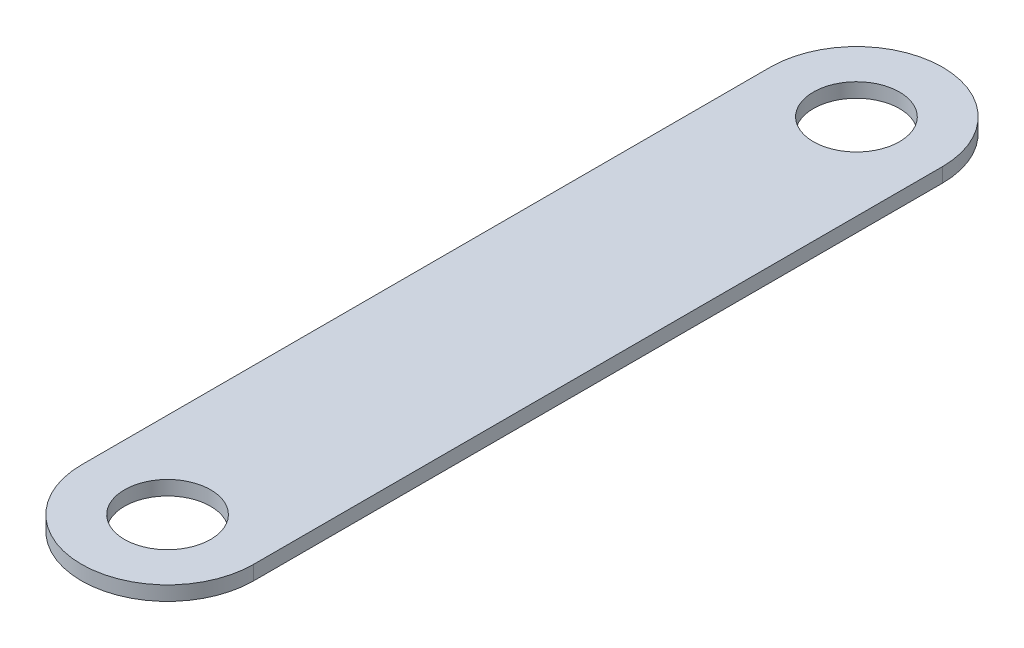
ISO-10303-21;
HEADER;
FILE_DESCRIPTION(('STEP AP214'),'2;1');
FILE_NAME('part.step','',(''),(''),'','','');
FILE_SCHEMA(('AUTOMOTIVE_DESIGN { 1 0 10303 214 1 1 1 1 }'));
ENDSEC;
DATA;
#1=APPLICATION_CONTEXT('core data for automotive mechanical design processes');
#2=APPLICATION_PROTOCOL_DEFINITION('international standard','automotive_design',2000,#1);
#3=PRODUCT_CONTEXT('',#1,'mechanical');
#4=PRODUCT('Part','Part','',(#3));
#5=PRODUCT_RELATED_PRODUCT_CATEGORY('part','',(#4));
#6=PRODUCT_DEFINITION_FORMATION('','',#4);
#7=PRODUCT_DEFINITION_CONTEXT('part definition',#1,'design');
#8=PRODUCT_DEFINITION('design','',#6,#7);
#9=PRODUCT_DEFINITION_SHAPE('','',#8);
#10=(LENGTH_UNIT() NAMED_UNIT(*) SI_UNIT(.MILLI.,.METRE.));
#11=(NAMED_UNIT(*) PLANE_ANGLE_UNIT() SI_UNIT($,.RADIAN.));
#12=(NAMED_UNIT(*) SI_UNIT($,.STERADIAN.) SOLID_ANGLE_UNIT());
#13=UNCERTAINTY_MEASURE_WITH_UNIT(LENGTH_MEASURE(1.E-05),#10,'distance_accuracy_value','');
#14=(GEOMETRIC_REPRESENTATION_CONTEXT(3) GLOBAL_UNCERTAINTY_ASSIGNED_CONTEXT((#13)) GLOBAL_UNIT_ASSIGNED_CONTEXT((#10,
#11,#12)) REPRESENTATION_CONTEXT('',''));
#15=CARTESIAN_POINT('',(0.,0.,0.));
#16=DIRECTION('',(0.,0.,1.));
#17=DIRECTION('',(1.,0.,0.));
#18=AXIS2_PLACEMENT_3D('',#15,#16,#17);
#19=CARTESIAN_POINT('',(0.,6.35,0.));
#20=DIRECTION('',(0.,1.,0.));
#21=DIRECTION('',(0.,0.,1.));
#22=AXIS2_PLACEMENT_3D('',#19,#20,#21);
#23=PLANE('',#22);
#24=CARTESIAN_POINT('',(0.,6.35,0.));
#25=DIRECTION('',(0.,1.,0.));
#26=DIRECTION('',(0.,0.,1.));
#27=AXIS2_PLACEMENT_3D('',#24,#25,#26);
#28=CIRCLE('',#27,19.05);
#29=CARTESIAN_POINT('',(0.,6.35,19.05));
#30=VERTEX_POINT('',#29);
#31=EDGE_CURVE('E100',#30,#30,#28,.T.);
#32=ORIENTED_EDGE('',*,*,#31,.F.);
#33=EDGE_LOOP('',(#32));
#34=FACE_BOUND('',#33,.T.);
#35=CARTESIAN_POINT('',(0.,6.35,0.));
#36=DIRECTION('',(0.,1.,0.));
#37=DIRECTION('',(0.,0.,1.));
#38=AXIS2_PLACEMENT_3D('',#35,#36,#37);
#39=CIRCLE('',#38,38.1);
#40=CARTESIAN_POINT('',(38.1,6.35,0.));
#41=VERTEX_POINT('',#40);
#42=CARTESIAN_POINT('',(-38.1,6.35,0.));
#43=VERTEX_POINT('',#42);
#44=EDGE_CURVE('E85',#41,#43,#39,.T.);
#45=ORIENTED_EDGE('',*,*,#44,.T.);
#46=DIRECTION('',(0.,0.,1.));
#47=VECTOR('',#46,1.);
#48=CARTESIAN_POINT('',(-38.1,6.35,0.));
#49=LINE('',#48,#47);
#50=CARTESIAN_POINT('',(-38.1,6.35,304.8));
#51=VERTEX_POINT('',#50);
#52=EDGE_CURVE('E80',#43,#51,#49,.T.);
#53=ORIENTED_EDGE('',*,*,#52,.T.);
#54=CARTESIAN_POINT('',(0.,6.35,304.8));
#55=DIRECTION('',(0.,1.,0.));
#56=DIRECTION('',(0.,0.,1.));
#57=AXIS2_PLACEMENT_3D('',#54,#55,#56);
#58=CIRCLE('',#57,38.1);
#59=CARTESIAN_POINT('',(38.1,6.35,304.8));
#60=VERTEX_POINT('',#59);
#61=EDGE_CURVE('E83',#51,#60,#58,.T.);
#62=ORIENTED_EDGE('',*,*,#61,.T.);
#63=DIRECTION('',(0.,0.,-1.));
#64=VECTOR('',#63,1.);
#65=CARTESIAN_POINT('',(38.1,6.35,0.));
#66=LINE('',#65,#64);
#67=EDGE_CURVE('E50',#60,#41,#66,.T.);
#68=ORIENTED_EDGE('',*,*,#67,.T.);
#69=EDGE_LOOP('',(#45,#53,#62,#68));
#70=FACE_BOUND('',#69,.T.);
#71=CARTESIAN_POINT('',(0.,6.35,304.8));
#72=DIRECTION('',(0.,1.,0.));
#73=DIRECTION('',(0.,0.,1.));
#74=AXIS2_PLACEMENT_3D('',#71,#72,#73);
#75=CIRCLE('',#74,19.05);
#76=CARTESIAN_POINT('',(0.,6.35,323.85));
#77=VERTEX_POINT('',#76);
#78=EDGE_CURVE('E115',#77,#77,#75,.T.);
#79=ORIENTED_EDGE('',*,*,#78,.F.);
#80=EDGE_LOOP('',(#79));
#81=FACE_BOUND('',#80,.T.);
#82=ADVANCED_FACE('F33',(#34,#70,#81),#23,.T.);
#83=CARTESIAN_POINT('',(0.,0.,0.));
#84=DIRECTION('',(0.,1.,0.));
#85=DIRECTION('',(0.,0.,1.));
#86=AXIS2_PLACEMENT_3D('',#83,#84,#85);
#87=PLANE('',#86);
#88=CARTESIAN_POINT('',(0.,0.,0.));
#89=DIRECTION('',(0.,1.,0.));
#90=DIRECTION('',(0.,0.,1.));
#91=AXIS2_PLACEMENT_3D('',#88,#89,#90);
#92=CIRCLE('',#91,38.1);
#93=CARTESIAN_POINT('',(38.1,0.,0.));
#94=VERTEX_POINT('',#93);
#95=CARTESIAN_POINT('',(-38.1,0.,0.));
#96=VERTEX_POINT('',#95);
#97=EDGE_CURVE('E97',#94,#96,#92,.T.);
#98=ORIENTED_EDGE('',*,*,#97,.F.);
#99=DIRECTION('',(0.,0.,-1.));
#100=VECTOR('',#99,1.);
#101=CARTESIAN_POINT('',(38.1,0.,0.));
#102=LINE('',#101,#100);
#103=CARTESIAN_POINT('',(38.1,0.,304.8));
#104=VERTEX_POINT('',#103);
#105=EDGE_CURVE('E73',#104,#94,#102,.T.);
#106=ORIENTED_EDGE('',*,*,#105,.F.);
#107=CARTESIAN_POINT('',(0.,0.,304.8));
#108=DIRECTION('',(0.,1.,0.));
#109=DIRECTION('',(0.,0.,1.));
#110=AXIS2_PLACEMENT_3D('',#107,#108,#109);
#111=CIRCLE('',#110,38.1);
#112=CARTESIAN_POINT('',(-38.1,0.,304.8));
#113=VERTEX_POINT('',#112);
#114=EDGE_CURVE('E67',#113,#104,#111,.T.);
#115=ORIENTED_EDGE('',*,*,#114,.F.);
#116=DIRECTION('',(0.,0.,1.));
#117=VECTOR('',#116,1.);
#118=CARTESIAN_POINT('',(-38.1,0.,0.));
#119=LINE('',#118,#117);
#120=EDGE_CURVE('E89',#96,#113,#119,.T.);
#121=ORIENTED_EDGE('',*,*,#120,.F.);
#122=EDGE_LOOP('',(#98,#106,#115,#121));
#123=FACE_BOUND('',#122,.T.);
#124=CARTESIAN_POINT('',(0.,0.,0.));
#125=DIRECTION('',(0.,1.,0.));
#126=DIRECTION('',(0.,0.,1.));
#127=AXIS2_PLACEMENT_3D('',#124,#125,#126);
#128=CIRCLE('',#127,19.05);
#129=CARTESIAN_POINT('',(0.,0.,19.05));
#130=VERTEX_POINT('',#129);
#131=EDGE_CURVE('E112',#130,#130,#128,.T.);
#132=ORIENTED_EDGE('',*,*,#131,.T.);
#133=EDGE_LOOP('',(#132));
#134=FACE_BOUND('',#133,.T.);
#135=CARTESIAN_POINT('',(0.,0.,304.8));
#136=DIRECTION('',(0.,1.,0.));
#137=DIRECTION('',(0.,0.,1.));
#138=AXIS2_PLACEMENT_3D('',#135,#136,#137);
#139=CIRCLE('',#138,19.05);
#140=CARTESIAN_POINT('',(0.,0.,323.85));
#141=VERTEX_POINT('',#140);
#142=EDGE_CURVE('E118',#141,#141,#139,.T.);
#143=ORIENTED_EDGE('',*,*,#142,.T.);
#144=EDGE_LOOP('',(#143));
#145=FACE_BOUND('',#144,.T.);
#146=ADVANCED_FACE('F108',(#123,#134,#145),#87,.F.);
#147=CARTESIAN_POINT('',(0.,6.35,0.));
#148=DIRECTION('',(0.,-1.,0.));
#149=DIRECTION('',(0.,0.,-1.));
#150=AXIS2_PLACEMENT_3D('',#147,#148,#149);
#151=CYLINDRICAL_SURFACE('',#150,38.1);
#152=ORIENTED_EDGE('',*,*,#97,.T.);
#153=DIRECTION('',(0.,-1.,0.));
#154=VECTOR('',#153,1.);
#155=CARTESIAN_POINT('',(-38.1,6.35,0.));
#156=LINE('',#155,#154);
#157=EDGE_CURVE('E11',#43,#96,#156,.T.);
#158=ORIENTED_EDGE('',*,*,#157,.F.);
#159=ORIENTED_EDGE('',*,*,#44,.F.);
#160=DIRECTION('',(0.,-1.,0.));
#161=VECTOR('',#160,1.);
#162=CARTESIAN_POINT('',(38.1,6.35,0.));
#163=LINE('',#162,#161);
#164=EDGE_CURVE('E93',#41,#94,#163,.T.);
#165=ORIENTED_EDGE('',*,*,#164,.T.);
#166=EDGE_LOOP('',(#152,#158,#159,#165));
#167=FACE_BOUND('',#166,.T.);
#168=ADVANCED_FACE('F35',(#167),#151,.T.);
#169=CARTESIAN_POINT('',(-38.1,6.35,0.));
#170=DIRECTION('',(1.,0.,0.));
#171=DIRECTION('',(0.,0.,-1.));
#172=AXIS2_PLACEMENT_3D('',#169,#170,#171);
#173=PLANE('',#172);
#174=ORIENTED_EDGE('',*,*,#120,.T.);
#175=DIRECTION('',(0.,-1.,0.));
#176=VECTOR('',#175,1.);
#177=CARTESIAN_POINT('',(-38.1,6.35,304.8));
#178=LINE('',#177,#176);
#179=EDGE_CURVE('E42',#51,#113,#178,.T.);
#180=ORIENTED_EDGE('',*,*,#179,.F.);
#181=ORIENTED_EDGE('',*,*,#52,.F.);
#182=ORIENTED_EDGE('',*,*,#157,.T.);
#183=EDGE_LOOP('',(#174,#180,#181,#182));
#184=FACE_BOUND('',#183,.T.);
#185=ADVANCED_FACE('F88',(#184),#173,.F.);
#186=CARTESIAN_POINT('',(0.,6.35,304.8));
#187=DIRECTION('',(0.,-1.,0.));
#188=DIRECTION('',(0.,0.,-1.));
#189=AXIS2_PLACEMENT_3D('',#186,#187,#188);
#190=CYLINDRICAL_SURFACE('',#189,38.1);
#191=ORIENTED_EDGE('',*,*,#114,.T.);
#192=DIRECTION('',(0.,-1.,0.));
#193=VECTOR('',#192,1.);
#194=CARTESIAN_POINT('',(38.1,6.35,304.8));
#195=LINE('',#194,#193);
#196=EDGE_CURVE('E90',#60,#104,#195,.T.);
#197=ORIENTED_EDGE('',*,*,#196,.F.);
#198=ORIENTED_EDGE('',*,*,#61,.F.);
#199=ORIENTED_EDGE('',*,*,#179,.T.);
#200=EDGE_LOOP('',(#191,#197,#198,#199));
#201=FACE_BOUND('',#200,.T.);
#202=ADVANCED_FACE('F91',(#201),#190,.T.);
#203=CARTESIAN_POINT('',(38.1,6.35,0.));
#204=DIRECTION('',(-1.,0.,0.));
#205=DIRECTION('',(0.,0.,1.));
#206=AXIS2_PLACEMENT_3D('',#203,#204,#205);
#207=PLANE('',#206);
#208=ORIENTED_EDGE('',*,*,#105,.T.);
#209=ORIENTED_EDGE('',*,*,#164,.F.);
#210=ORIENTED_EDGE('',*,*,#67,.F.);
#211=ORIENTED_EDGE('',*,*,#196,.T.);
#212=EDGE_LOOP('',(#208,#209,#210,#211));
#213=FACE_BOUND('',#212,.T.);
#214=ADVANCED_FACE('F105',(#213),#207,.F.);
#215=CARTESIAN_POINT('',(0.,6.35,0.));
#216=DIRECTION('',(0.,-1.,0.));
#217=DIRECTION('',(0.,0.,-1.));
#218=AXIS2_PLACEMENT_3D('',#215,#216,#217);
#219=CYLINDRICAL_SURFACE('',#218,19.05);
#220=ORIENTED_EDGE('',*,*,#31,.T.);
#221=EDGE_LOOP('',(#220));
#222=FACE_BOUND('',#221,.T.);
#223=ORIENTED_EDGE('',*,*,#131,.F.);
#224=EDGE_LOOP('',(#223));
#225=FACE_BOUND('',#224,.T.);
#226=ADVANCED_FACE('F135',(#222,#225),#219,.F.);
#227=CARTESIAN_POINT('',(0.,6.35,304.8));
#228=DIRECTION('',(0.,-1.,0.));
#229=DIRECTION('',(0.,0.,-1.));
#230=AXIS2_PLACEMENT_3D('',#227,#228,#229);
#231=CYLINDRICAL_SURFACE('',#230,19.05);
#232=ORIENTED_EDGE('',*,*,#78,.T.);
#233=EDGE_LOOP('',(#232));
#234=FACE_BOUND('',#233,.T.);
#235=ORIENTED_EDGE('',*,*,#142,.F.);
#236=EDGE_LOOP('',(#235));
#237=FACE_BOUND('',#236,.T.);
#238=ADVANCED_FACE('F124',(#234,#237),#231,.F.);
#239=CLOSED_SHELL('',(#82,#146,#168,#185,#202,#214,#226,#238));
#240=MANIFOLD_SOLID_BREP('B2',#239);
#241=ADVANCED_BREP_SHAPE_REPRESENTATION('',(#18,#240),#14);
#242=SHAPE_DEFINITION_REPRESENTATION(#9,#241);
ENDSEC;
END-ISO-10303-21;
